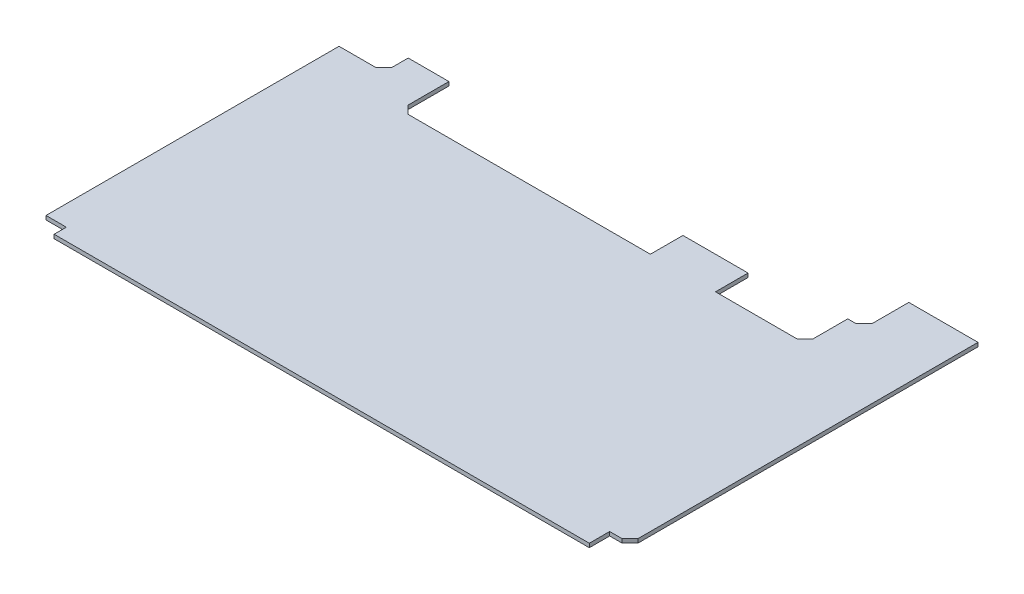
ISO-10303-21;
HEADER;
FILE_DESCRIPTION(('STEP AP214'),'2;1');
FILE_NAME('part.step','',(''),(''),'','','');
FILE_SCHEMA(('AUTOMOTIVE_DESIGN { 1 0 10303 214 1 1 1 1 }'));
ENDSEC;
DATA;
#1=APPLICATION_CONTEXT('core data for automotive mechanical design processes');
#2=APPLICATION_PROTOCOL_DEFINITION('international standard','automotive_design',2000,#1);
#3=PRODUCT_CONTEXT('',#1,'mechanical');
#4=PRODUCT('Part','Part','',(#3));
#5=PRODUCT_RELATED_PRODUCT_CATEGORY('part','',(#4));
#6=PRODUCT_DEFINITION_FORMATION('','',#4);
#7=PRODUCT_DEFINITION_CONTEXT('part definition',#1,'design');
#8=PRODUCT_DEFINITION('design','',#6,#7);
#9=PRODUCT_DEFINITION_SHAPE('','',#8);
#10=(LENGTH_UNIT() NAMED_UNIT(*) SI_UNIT(.MILLI.,.METRE.));
#11=(NAMED_UNIT(*) PLANE_ANGLE_UNIT() SI_UNIT($,.RADIAN.));
#12=(NAMED_UNIT(*) SI_UNIT($,.STERADIAN.) SOLID_ANGLE_UNIT());
#13=UNCERTAINTY_MEASURE_WITH_UNIT(LENGTH_MEASURE(1.E-05),#10,'distance_accuracy_value','');
#14=(GEOMETRIC_REPRESENTATION_CONTEXT(3) GLOBAL_UNCERTAINTY_ASSIGNED_CONTEXT((#13)) GLOBAL_UNIT_ASSIGNED_CONTEXT((#10,
#11,#12)) REPRESENTATION_CONTEXT('',''));
#15=CARTESIAN_POINT('',(0.,0.,0.));
#16=DIRECTION('',(0.,0.,1.));
#17=DIRECTION('',(1.,0.,0.));
#18=AXIS2_PLACEMENT_3D('',#15,#16,#17);
#19=CARTESIAN_POINT('',(-78.978125,-0.000999999999999916,-37.703125));
#20=DIRECTION('',(0.,0.,1.));
#21=DIRECTION('',(1.,0.,0.));
#22=AXIS2_PLACEMENT_3D('',#19,#20,#21);
#23=PLANE('',#22);
#24=DIRECTION('',(1.,0.,0.));
#25=VECTOR('',#24,1.);
#26=CARTESIAN_POINT('',(-78.978125,0.,-37.703125));
#27=LINE('',#26,#25);
#28=CARTESIAN_POINT('',(44.053125,0.,-37.703125));
#29=VERTEX_POINT('',#28);
#30=CARTESIAN_POINT('',(75.803125,0.,-37.703125));
#31=VERTEX_POINT('',#30);
#32=EDGE_CURVE('E387',#29,#31,#27,.T.);
#33=ORIENTED_EDGE('',*,*,#32,.F.);
#34=DIRECTION('',(0.,1.,0.));
#35=VECTOR('',#34,1.);
#36=CARTESIAN_POINT('',(44.053125,-28.3980633142473,-37.703125));
#37=LINE('',#36,#35);
#38=CARTESIAN_POINT('',(44.053125,1.524,-37.703125));
#39=VERTEX_POINT('',#38);
#40=EDGE_CURVE('E351',#29,#39,#37,.T.);
#41=ORIENTED_EDGE('',*,*,#40,.T.);
#42=DIRECTION('',(1.,0.,0.));
#43=VECTOR('',#42,1.);
#44=CARTESIAN_POINT('',(-78.978125,1.524,-37.703125));
#45=LINE('',#44,#43);
#46=CARTESIAN_POINT('',(75.803125,1.524,-37.703125));
#47=VERTEX_POINT('',#46);
#48=EDGE_CURVE('E380',#39,#47,#45,.T.);
#49=ORIENTED_EDGE('',*,*,#48,.T.);
#50=DIRECTION('',(0.,-1.,0.));
#51=VECTOR('',#50,1.);
#52=CARTESIAN_POINT('',(75.803125,0.,-37.703125));
#53=LINE('',#52,#51);
#54=EDGE_CURVE('E245',#47,#31,#53,.T.);
#55=ORIENTED_EDGE('',*,*,#54,.T.);
#56=EDGE_LOOP('',(#33,#41,#49,#55));
#57=FACE_BOUND('',#56,.T.);
#58=ADVANCED_FACE('F34',(#57),#23,.F.);
#59=CARTESIAN_POINT('',(112.315625,1.524,71.834375));
#60=DIRECTION('',(-1.,0.,0.));
#61=DIRECTION('',(0.,0.,1.));
#62=AXIS2_PLACEMENT_3D('',#59,#60,#61);
#63=PLANE('',#62);
#64=DIRECTION('',(0.,0.,-1.));
#65=VECTOR('',#64,1.);
#66=CARTESIAN_POINT('',(112.315625,1.524,71.834375));
#67=LINE('',#66,#65);
#68=CARTESIAN_POINT('',(112.315625,1.524,60.721875));
#69=VERTEX_POINT('',#68);
#70=CARTESIAN_POINT('',(112.315625,1.524,-71.834375));
#71=VERTEX_POINT('',#70);
#72=EDGE_CURVE('E225',#69,#71,#67,.T.);
#73=ORIENTED_EDGE('',*,*,#72,.F.);
#74=DIRECTION('',(0.,-1.,0.));
#75=VECTOR('',#74,1.);
#76=CARTESIAN_POINT('',(112.315625,1.524,60.721875));
#77=LINE('',#76,#75);
#78=CARTESIAN_POINT('',(112.315625,0.,60.721875));
#79=VERTEX_POINT('',#78);
#80=EDGE_CURVE('E42',#69,#79,#77,.T.);
#81=ORIENTED_EDGE('',*,*,#80,.T.);
#82=DIRECTION('',(0.,0.,-1.));
#83=VECTOR('',#82,1.);
#84=CARTESIAN_POINT('',(112.315625,0.,71.834375));
#85=LINE('',#84,#83);
#86=CARTESIAN_POINT('',(112.315625,0.,-71.834375));
#87=VERTEX_POINT('',#86);
#88=EDGE_CURVE('E390',#79,#87,#85,.T.);
#89=ORIENTED_EDGE('',*,*,#88,.T.);
#90=DIRECTION('',(0.,-1.,0.));
#91=VECTOR('',#90,1.);
#92=CARTESIAN_POINT('',(112.315625,1.524,-71.834375));
#93=LINE('',#92,#91);
#94=EDGE_CURVE('E235',#71,#87,#93,.T.);
#95=ORIENTED_EDGE('',*,*,#94,.F.);
#96=EDGE_LOOP('',(#73,#81,#89,#95));
#97=FACE_BOUND('',#96,.T.);
#98=ADVANCED_FACE('F412',(#97),#63,.F.);
#99=CARTESIAN_POINT('',(-112.315625,1.524,-71.834375));
#100=DIRECTION('',(0.,0.,1.));
#101=DIRECTION('',(1.,0.,0.));
#102=AXIS2_PLACEMENT_3D('',#99,#100,#101);
#103=PLANE('',#102);
#104=DIRECTION('',(-1.,0.,0.));
#105=VECTOR('',#104,1.);
#106=CARTESIAN_POINT('',(-112.315625,0.,-71.834375));
#107=LINE('',#106,#105);
#108=CARTESIAN_POINT('',(85.328125,0.,-71.834375));
#109=VERTEX_POINT('',#108);
#110=EDGE_CURVE('E231',#87,#109,#107,.T.);
#111=ORIENTED_EDGE('',*,*,#110,.T.);
#112=DIRECTION('',(0.,1.,0.));
#113=VECTOR('',#112,1.);
#114=CARTESIAN_POINT('',(85.328125,-0.000999999999999916,-71.834375));
#115=LINE('',#114,#113);
#116=CARTESIAN_POINT('',(85.328125,1.524,-71.834375));
#117=VERTEX_POINT('',#116);
#118=EDGE_CURVE('E317',#109,#117,#115,.T.);
#119=ORIENTED_EDGE('',*,*,#118,.T.);
#120=DIRECTION('',(-1.,0.,0.));
#121=VECTOR('',#120,1.);
#122=CARTESIAN_POINT('',(-112.315625,1.524,-71.834375));
#123=LINE('',#122,#121);
#124=EDGE_CURVE('E228',#71,#117,#123,.T.);
#125=ORIENTED_EDGE('',*,*,#124,.F.);
#126=ORIENTED_EDGE('',*,*,#94,.T.);
#127=EDGE_LOOP('',(#111,#119,#125,#126));
#128=FACE_BOUND('',#127,.T.);
#129=ADVANCED_FACE('F401',(#128),#103,.F.);
#130=CARTESIAN_POINT('',(-112.315625,1.524,71.834375));
#131=DIRECTION('',(1.,0.,0.));
#132=DIRECTION('',(0.,0.,-1.));
#133=AXIS2_PLACEMENT_3D('',#130,#131,#132);
#134=PLANE('',#133);
#135=DIRECTION('',(0.,0.,1.));
#136=VECTOR('',#135,1.);
#137=CARTESIAN_POINT('',(-112.315625,0.,71.834375));
#138=LINE('',#137,#136);
#139=CARTESIAN_POINT('',(-112.315625,0.,-47.228125));
#140=VERTEX_POINT('',#139);
#141=CARTESIAN_POINT('',(-112.315625,0.,67.071875));
#142=VERTEX_POINT('',#141);
#143=EDGE_CURVE('E226',#140,#142,#138,.T.);
#144=ORIENTED_EDGE('',*,*,#143,.T.);
#145=DIRECTION('',(0.,1.,0.));
#146=VECTOR('',#145,1.);
#147=CARTESIAN_POINT('',(-112.315625,-0.000999999999999916,67.071875));
#148=LINE('',#147,#146);
#149=CARTESIAN_POINT('',(-112.315625,1.524,67.071875));
#150=VERTEX_POINT('',#149);
#151=EDGE_CURVE('E303',#142,#150,#148,.T.);
#152=ORIENTED_EDGE('',*,*,#151,.T.);
#153=DIRECTION('',(0.,0.,1.));
#154=VECTOR('',#153,1.);
#155=CARTESIAN_POINT('',(-112.315625,1.524,71.834375));
#156=LINE('',#155,#154);
#157=CARTESIAN_POINT('',(-112.315625,1.524,-47.228125));
#158=VERTEX_POINT('',#157);
#159=EDGE_CURVE('E394',#158,#150,#156,.T.);
#160=ORIENTED_EDGE('',*,*,#159,.F.);
#161=DIRECTION('',(0.,1.,0.));
#162=VECTOR('',#161,1.);
#163=CARTESIAN_POINT('',(-112.315625,-0.000999999999999916,-47.228125));
#164=LINE('',#163,#162);
#165=EDGE_CURVE('E339',#140,#158,#164,.T.);
#166=ORIENTED_EDGE('',*,*,#165,.F.);
#167=EDGE_LOOP('',(#144,#152,#160,#166));
#168=FACE_BOUND('',#167,.T.);
#169=ADVANCED_FACE('F479',(#168),#134,.F.);
#170=CARTESIAN_POINT('',(-112.315625,1.524,71.834375));
#171=DIRECTION('',(0.,0.,-1.));
#172=DIRECTION('',(-1.,0.,0.));
#173=AXIS2_PLACEMENT_3D('',#170,#171,#172);
#174=PLANE('',#173);
#175=DIRECTION('',(1.,0.,0.));
#176=VECTOR('',#175,1.);
#177=CARTESIAN_POINT('',(-112.315625,0.,71.834375));
#178=LINE('',#177,#176);
#179=CARTESIAN_POINT('',(-104.378125,0.,71.834375));
#180=VERTEX_POINT('',#179);
#181=CARTESIAN_POINT('',(104.378125,0.,71.834375));
#182=VERTEX_POINT('',#181);
#183=EDGE_CURVE('E217',#180,#182,#178,.T.);
#184=ORIENTED_EDGE('',*,*,#183,.T.);
#185=DIRECTION('',(0.,1.,0.));
#186=VECTOR('',#185,1.);
#187=CARTESIAN_POINT('',(104.378125,-0.000999999999999916,71.834375));
#188=LINE('',#187,#186);
#189=CARTESIAN_POINT('',(104.378125,1.524,71.834375));
#190=VERTEX_POINT('',#189);
#191=EDGE_CURVE('E199',#182,#190,#188,.T.);
#192=ORIENTED_EDGE('',*,*,#191,.T.);
#193=DIRECTION('',(1.,0.,0.));
#194=VECTOR('',#193,1.);
#195=CARTESIAN_POINT('',(-112.315625,1.524,71.834375));
#196=LINE('',#195,#194);
#197=CARTESIAN_POINT('',(-104.378125,1.524,71.834375));
#198=VERTEX_POINT('',#197);
#199=EDGE_CURVE('E239',#198,#190,#196,.T.);
#200=ORIENTED_EDGE('',*,*,#199,.F.);
#201=DIRECTION('',(0.,1.,0.));
#202=VECTOR('',#201,1.);
#203=CARTESIAN_POINT('',(-104.378125,-0.000999999999999916,71.834375));
#204=LINE('',#203,#202);
#205=EDGE_CURVE('E224',#180,#198,#204,.T.);
#206=ORIENTED_EDGE('',*,*,#205,.F.);
#207=EDGE_LOOP('',(#184,#192,#200,#206));
#208=FACE_BOUND('',#207,.T.);
#209=ADVANCED_FACE('F223',(#208),#174,.F.);
#210=CARTESIAN_POINT('',(112.315625,1.524,-71.834375));
#211=DIRECTION('',(0.,-1.,0.));
#212=DIRECTION('',(0.,0.,-1.));
#213=AXIS2_PLACEMENT_3D('',#210,#211,#212);
#214=PLANE('',#213);
#215=DIRECTION('',(-1.,0.,0.));
#216=VECTOR('',#215,1.);
#217=CARTESIAN_POINT('',(112.315625,1.524,63.896875));
#218=LINE('',#217,#216);
#219=CARTESIAN_POINT('',(109.140625,1.524,63.896875));
#220=VERTEX_POINT('',#219);
#221=CARTESIAN_POINT('',(104.378125,1.524,63.896875));
#222=VERTEX_POINT('',#221);
#223=EDGE_CURVE('E220',#220,#222,#218,.T.);
#224=ORIENTED_EDGE('',*,*,#223,.F.);
#225=DIRECTION('',(-0.707106781186544,0.,0.707106781186551));
#226=VECTOR('',#225,1.);
#227=CARTESIAN_POINT('',(109.140625,1.524,63.896875));
#228=LINE('',#227,#226);
#229=EDGE_CURVE('E56',#220,#69,#228,.F.);
#230=ORIENTED_EDGE('',*,*,#229,.T.);
#231=ORIENTED_EDGE('',*,*,#72,.T.);
#232=ORIENTED_EDGE('',*,*,#124,.T.);
#233=DIRECTION('',(0.,0.,-1.));
#234=VECTOR('',#233,1.);
#235=CARTESIAN_POINT('',(85.328125,1.524,-71.834375));
#236=LINE('',#235,#234);
#237=CARTESIAN_POINT('',(85.328125,1.524,-57.5468750000001));
#238=VERTEX_POINT('',#237);
#239=EDGE_CURVE('E314',#238,#117,#236,.T.);
#240=ORIENTED_EDGE('',*,*,#239,.F.);
#241=DIRECTION('',(0.707106781186541,0.,-0.707106781186554));
#242=VECTOR('',#241,1.);
#243=CARTESIAN_POINT('',(105.965625,1.524,-78.1843750000001));
#244=LINE('',#243,#242);
#245=CARTESIAN_POINT('',(82.153125,1.524,-54.371875));
#246=VERTEX_POINT('',#245);
#247=EDGE_CURVE('E275',#238,#246,#244,.F.);
#248=ORIENTED_EDGE('',*,*,#247,.T.);
#249=DIRECTION('',(1.,0.,0.));
#250=VECTOR('',#249,1.);
#251=CARTESIAN_POINT('',(78.978125,1.524,-54.371875));
#252=LINE('',#251,#250);
#253=CARTESIAN_POINT('',(78.978125,1.524,-54.371875));
#254=VERTEX_POINT('',#253);
#255=EDGE_CURVE('E311',#254,#246,#252,.T.);
#256=ORIENTED_EDGE('',*,*,#255,.F.);
#257=DIRECTION('',(0.,0.,-1.));
#258=VECTOR('',#257,1.);
#259=CARTESIAN_POINT('',(78.978125,1.524,-71.834375));
#260=LINE('',#259,#258);
#261=CARTESIAN_POINT('',(78.978125,1.524,-40.8781250000001));
#262=VERTEX_POINT('',#261);
#263=EDGE_CURVE('E384',#262,#254,#260,.T.);
#264=ORIENTED_EDGE('',*,*,#263,.F.);
#265=DIRECTION('',(0.707106781186541,0.,-0.707106781186554));
#266=VECTOR('',#265,1.);
#267=CARTESIAN_POINT('',(111.125,1.524,-73.0250000000003));
#268=LINE('',#267,#266);
#269=EDGE_CURVE('E251',#262,#47,#268,.F.);
#270=ORIENTED_EDGE('',*,*,#269,.T.);
#271=ORIENTED_EDGE('',*,*,#48,.F.);
#272=DIRECTION('',(0.,0.,-1.));
#273=VECTOR('',#272,1.);
#274=CARTESIAN_POINT('',(44.053125,1.524,-37.703125));
#275=LINE('',#274,#273);
#276=CARTESIAN_POINT('',(44.053125,1.524,-50.403125));
#277=VERTEX_POINT('',#276);
#278=EDGE_CURVE('E352',#39,#277,#275,.T.);
#279=ORIENTED_EDGE('',*,*,#278,.T.);
#280=DIRECTION('',(-1.,0.,0.));
#281=VECTOR('',#280,1.);
#282=CARTESIAN_POINT('',(18.653125,1.524,-50.403125));
#283=LINE('',#282,#281);
#284=CARTESIAN_POINT('',(18.653125,1.524,-50.403125));
#285=VERTEX_POINT('',#284);
#286=EDGE_CURVE('E348',#277,#285,#283,.T.);
#287=ORIENTED_EDGE('',*,*,#286,.T.);
#288=DIRECTION('',(0.,0.,1.));
#289=VECTOR('',#288,1.);
#290=CARTESIAN_POINT('',(18.653125,1.524,-37.703125));
#291=LINE('',#290,#289);
#292=CARTESIAN_POINT('',(18.653125,1.524,-37.703125));
#293=VERTEX_POINT('',#292);
#294=EDGE_CURVE('E343',#285,#293,#291,.T.);
#295=ORIENTED_EDGE('',*,*,#294,.T.);
#296=CARTESIAN_POINT('',(-75.8031249999999,1.524,-37.703125));
#297=VERTEX_POINT('',#296);
#298=EDGE_CURVE('E381',#297,#293,#45,.T.);
#299=ORIENTED_EDGE('',*,*,#298,.F.);
#300=DIRECTION('',(0.707106781186554,0.,0.707106781186541));
#301=VECTOR('',#300,1.);
#302=CARTESIAN_POINT('',(1.19062500000165,1.524,39.2906250000003));
#303=LINE('',#302,#301);
#304=CARTESIAN_POINT('',(-78.978125,1.524,-40.878125));
#305=VERTEX_POINT('',#304);
#306=EDGE_CURVE('E256',#297,#305,#303,.F.);
#307=ORIENTED_EDGE('',*,*,#306,.T.);
#308=DIRECTION('',(0.,0.,1.));
#309=VECTOR('',#308,1.);
#310=CARTESIAN_POINT('',(-78.978125,1.524,-71.834375));
#311=LINE('',#310,#309);
#312=CARTESIAN_POINT('',(-78.978125,1.524,-56.753125));
#313=VERTEX_POINT('',#312);
#314=EDGE_CURVE('E378',#313,#305,#311,.T.);
#315=ORIENTED_EDGE('',*,*,#314,.F.);
#316=DIRECTION('',(1.,0.,0.));
#317=VECTOR('',#316,1.);
#318=CARTESIAN_POINT('',(-78.978125,1.524,-56.753125));
#319=LINE('',#318,#317);
#320=CARTESIAN_POINT('',(-94.853125,1.524,-56.753125));
#321=VERTEX_POINT('',#320);
#322=EDGE_CURVE('E337',#321,#313,#319,.T.);
#323=ORIENTED_EDGE('',*,*,#322,.F.);
#324=DIRECTION('',(0.,0.,-1.));
#325=VECTOR('',#324,1.);
#326=CARTESIAN_POINT('',(-94.853125,1.524,-56.753125));
#327=LINE('',#326,#325);
#328=CARTESIAN_POINT('',(-94.853125,1.524,-50.4031250000001));
#329=VERTEX_POINT('',#328);
#330=EDGE_CURVE('E335',#329,#321,#327,.T.);
#331=ORIENTED_EDGE('',*,*,#330,.F.);
#332=DIRECTION('',(0.707106781186541,0.,-0.707106781186554));
#333=VECTOR('',#332,1.);
#334=CARTESIAN_POINT('',(19.4468749999981,1.524,-164.703125));
#335=LINE('',#334,#333);
#336=CARTESIAN_POINT('',(-98.028125,1.524,-47.228125));
#337=VERTEX_POINT('',#336);
#338=EDGE_CURVE('E271',#329,#337,#335,.F.);
#339=ORIENTED_EDGE('',*,*,#338,.T.);
#340=DIRECTION('',(1.,0.,0.));
#341=VECTOR('',#340,1.);
#342=CARTESIAN_POINT('',(-94.853125,1.524,-47.228125));
#343=LINE('',#342,#341);
#344=EDGE_CURVE('E332',#158,#337,#343,.T.);
#345=ORIENTED_EDGE('',*,*,#344,.F.);
#346=ORIENTED_EDGE('',*,*,#159,.T.);
#347=DIRECTION('',(-1.,0.,0.));
#348=VECTOR('',#347,1.);
#349=CARTESIAN_POINT('',(-112.315625,1.524,67.071875));
#350=LINE('',#349,#348);
#351=CARTESIAN_POINT('',(-104.378125,1.524,67.071875));
#352=VERTEX_POINT('',#351);
#353=EDGE_CURVE('E301',#352,#150,#350,.T.);
#354=ORIENTED_EDGE('',*,*,#353,.F.);
#355=DIRECTION('',(0.,0.,-1.));
#356=VECTOR('',#355,1.);
#357=CARTESIAN_POINT('',(-104.378125,1.524,71.834375));
#358=LINE('',#357,#356);
#359=EDGE_CURVE('E298',#198,#352,#358,.T.);
#360=ORIENTED_EDGE('',*,*,#359,.F.);
#361=ORIENTED_EDGE('',*,*,#199,.T.);
#362=DIRECTION('',(0.,0.,1.));
#363=VECTOR('',#362,1.);
#364=CARTESIAN_POINT('',(104.378125,1.524,71.834375));
#365=LINE('',#364,#363);
#366=EDGE_CURVE('E205',#222,#190,#365,.T.);
#367=ORIENTED_EDGE('',*,*,#366,.F.);
#368=EDGE_LOOP('',(#224,#230,#231,#232,#240,#248,#256,#264,#270,#271,#279,#287,#295,#299,#307,
#315,#323,#331,#339,#345,#346,#354,#360,#361,#367));
#369=FACE_BOUND('',#368,.T.);
#370=ADVANCED_FACE('F287',(#369),#214,.F.);
#371=CARTESIAN_POINT('',(112.315625,0.,-71.834375));
#372=DIRECTION('',(0.,-1.,0.));
#373=DIRECTION('',(0.,0.,-1.));
#374=AXIS2_PLACEMENT_3D('',#371,#372,#373);
#375=PLANE('',#374);
#376=ORIENTED_EDGE('',*,*,#88,.F.);
#377=DIRECTION('',(0.707106781186544,0.,-0.707106781186551));
#378=VECTOR('',#377,1.);
#379=CARTESIAN_POINT('',(178.59375,0.,-5.55625000000054));
#380=LINE('',#379,#378);
#381=CARTESIAN_POINT('',(109.140625,0.,63.896875));
#382=VERTEX_POINT('',#381);
#383=EDGE_CURVE('E11',#79,#382,#380,.F.);
#384=ORIENTED_EDGE('',*,*,#383,.T.);
#385=DIRECTION('',(-1.,0.,0.));
#386=VECTOR('',#385,1.);
#387=CARTESIAN_POINT('',(112.315625,0.,63.896875));
#388=LINE('',#387,#386);
#389=CARTESIAN_POINT('',(104.378125,0.,63.896875));
#390=VERTEX_POINT('',#389);
#391=EDGE_CURVE('E210',#382,#390,#388,.T.);
#392=ORIENTED_EDGE('',*,*,#391,.T.);
#393=DIRECTION('',(0.,0.,1.));
#394=VECTOR('',#393,1.);
#395=CARTESIAN_POINT('',(104.378125,0.,71.834375));
#396=LINE('',#395,#394);
#397=EDGE_CURVE('E203',#390,#182,#396,.T.);
#398=ORIENTED_EDGE('',*,*,#397,.T.);
#399=ORIENTED_EDGE('',*,*,#183,.F.);
#400=DIRECTION('',(0.,0.,-1.));
#401=VECTOR('',#400,1.);
#402=CARTESIAN_POINT('',(-104.378125,0.,71.834375));
#403=LINE('',#402,#401);
#404=CARTESIAN_POINT('',(-104.378125,0.,67.071875));
#405=VERTEX_POINT('',#404);
#406=EDGE_CURVE('E293',#180,#405,#403,.T.);
#407=ORIENTED_EDGE('',*,*,#406,.T.);
#408=DIRECTION('',(-1.,0.,0.));
#409=VECTOR('',#408,1.);
#410=CARTESIAN_POINT('',(-112.315625,0.,67.071875));
#411=LINE('',#410,#409);
#412=EDGE_CURVE('E295',#405,#142,#411,.T.);
#413=ORIENTED_EDGE('',*,*,#412,.T.);
#414=ORIENTED_EDGE('',*,*,#143,.F.);
#415=DIRECTION('',(1.,0.,0.));
#416=VECTOR('',#415,1.);
#417=CARTESIAN_POINT('',(-94.853125,0.,-47.228125));
#418=LINE('',#417,#416);
#419=CARTESIAN_POINT('',(-98.028125,0.,-47.228125));
#420=VERTEX_POINT('',#419);
#421=EDGE_CURVE('E324',#140,#420,#418,.T.);
#422=ORIENTED_EDGE('',*,*,#421,.T.);
#423=DIRECTION('',(-0.707106781186541,0.,0.707106781186554));
#424=VECTOR('',#423,1.);
#425=CARTESIAN_POINT('',(-94.853125,0.,-50.4031250000001));
#426=LINE('',#425,#424);
#427=CARTESIAN_POINT('',(-94.853125,0.,-50.4031250000001));
#428=VERTEX_POINT('',#427);
#429=EDGE_CURVE('E273',#420,#428,#426,.F.);
#430=ORIENTED_EDGE('',*,*,#429,.T.);
#431=DIRECTION('',(0.,0.,-1.));
#432=VECTOR('',#431,1.);
#433=CARTESIAN_POINT('',(-94.853125,0.,-56.753125));
#434=LINE('',#433,#432);
#435=CARTESIAN_POINT('',(-94.853125,0.,-56.753125));
#436=VERTEX_POINT('',#435);
#437=EDGE_CURVE('E327',#428,#436,#434,.T.);
#438=ORIENTED_EDGE('',*,*,#437,.T.);
#439=DIRECTION('',(1.,0.,0.));
#440=VECTOR('',#439,1.);
#441=CARTESIAN_POINT('',(-78.978125,0.,-56.753125));
#442=LINE('',#441,#440);
#443=CARTESIAN_POINT('',(-78.978125,0.,-56.753125));
#444=VERTEX_POINT('',#443);
#445=EDGE_CURVE('E329',#436,#444,#442,.T.);
#446=ORIENTED_EDGE('',*,*,#445,.T.);
#447=DIRECTION('',(0.,0.,1.));
#448=VECTOR('',#447,1.);
#449=CARTESIAN_POINT('',(-78.978125,0.,-71.834375));
#450=LINE('',#449,#448);
#451=CARTESIAN_POINT('',(-78.978125,0.,-40.878125));
#452=VERTEX_POINT('',#451);
#453=EDGE_CURVE('E376',#444,#452,#450,.T.);
#454=ORIENTED_EDGE('',*,*,#453,.T.);
#455=DIRECTION('',(-0.707106781186554,0.,-0.707106781186541));
#456=VECTOR('',#455,1.);
#457=CARTESIAN_POINT('',(-75.8031249999999,0.,-37.703125));
#458=LINE('',#457,#456);
#459=CARTESIAN_POINT('',(-75.8031249999999,0.,-37.703125));
#460=VERTEX_POINT('',#459);
#461=EDGE_CURVE('E259',#452,#460,#458,.F.);
#462=ORIENTED_EDGE('',*,*,#461,.T.);
#463=CARTESIAN_POINT('',(18.653125,0.,-37.703125));
#464=VERTEX_POINT('',#463);
#465=EDGE_CURVE('E388',#460,#464,#27,.T.);
#466=ORIENTED_EDGE('',*,*,#465,.T.);
#467=DIRECTION('',(0.,0.,1.));
#468=VECTOR('',#467,1.);
#469=CARTESIAN_POINT('',(18.653125,0.,-37.703125));
#470=LINE('',#469,#468);
#471=CARTESIAN_POINT('',(18.653125,0.,-50.403125));
#472=VERTEX_POINT('',#471);
#473=EDGE_CURVE('E357',#472,#464,#470,.T.);
#474=ORIENTED_EDGE('',*,*,#473,.F.);
#475=DIRECTION('',(-1.,0.,0.));
#476=VECTOR('',#475,1.);
#477=CARTESIAN_POINT('',(18.653125,0.,-50.403125));
#478=LINE('',#477,#476);
#479=CARTESIAN_POINT('',(44.053125,0.,-50.403125));
#480=VERTEX_POINT('',#479);
#481=EDGE_CURVE('E361',#480,#472,#478,.T.);
#482=ORIENTED_EDGE('',*,*,#481,.F.);
#483=DIRECTION('',(0.,0.,-1.));
#484=VECTOR('',#483,1.);
#485=CARTESIAN_POINT('',(44.053125,0.,-37.703125));
#486=LINE('',#485,#484);
#487=EDGE_CURVE('E365',#29,#480,#486,.T.);
#488=ORIENTED_EDGE('',*,*,#487,.F.);
#489=ORIENTED_EDGE('',*,*,#32,.T.);
#490=DIRECTION('',(-0.707106781186541,0.,0.707106781186554));
#491=VECTOR('',#490,1.);
#492=CARTESIAN_POINT('',(78.978125,0.,-40.8781250000001));
#493=LINE('',#492,#491);
#494=CARTESIAN_POINT('',(78.978125,0.,-40.8781250000001));
#495=VERTEX_POINT('',#494);
#496=EDGE_CURVE('E254',#31,#495,#493,.F.);
#497=ORIENTED_EDGE('',*,*,#496,.T.);
#498=DIRECTION('',(0.,0.,-1.));
#499=VECTOR('',#498,1.);
#500=CARTESIAN_POINT('',(78.978125,0.,-71.834375));
#501=LINE('',#500,#499);
#502=CARTESIAN_POINT('',(78.978125,0.,-54.371875));
#503=VERTEX_POINT('',#502);
#504=EDGE_CURVE('E373',#495,#503,#501,.T.);
#505=ORIENTED_EDGE('',*,*,#504,.T.);
#506=DIRECTION('',(1.,0.,0.));
#507=VECTOR('',#506,1.);
#508=CARTESIAN_POINT('',(78.978125,0.,-54.371875));
#509=LINE('',#508,#507);
#510=CARTESIAN_POINT('',(82.153125,0.,-54.371875));
#511=VERTEX_POINT('',#510);
#512=EDGE_CURVE('E320',#503,#511,#509,.T.);
#513=ORIENTED_EDGE('',*,*,#512,.T.);
#514=DIRECTION('',(-0.707106781186541,0.,0.707106781186554));
#515=VECTOR('',#514,1.);
#516=CARTESIAN_POINT('',(85.328125,0.,-57.5468750000001));
#517=LINE('',#516,#515);
#518=CARTESIAN_POINT('',(85.328125,0.,-57.5468750000001));
#519=VERTEX_POINT('',#518);
#520=EDGE_CURVE('E277',#511,#519,#517,.F.);
#521=ORIENTED_EDGE('',*,*,#520,.T.);
#522=DIRECTION('',(0.,0.,-1.));
#523=VECTOR('',#522,1.);
#524=CARTESIAN_POINT('',(85.328125,0.,-71.834375));
#525=LINE('',#524,#523);
#526=EDGE_CURVE('E306',#519,#109,#525,.T.);
#527=ORIENTED_EDGE('',*,*,#526,.T.);
#528=ORIENTED_EDGE('',*,*,#110,.F.);
#529=EDGE_LOOP('',(#376,#384,#392,#398,#399,#407,#413,#414,#422,#430,#438,#446,#454,#462,#466,
#474,#482,#488,#489,#497,#505,#513,#521,#527,#528));
#530=FACE_BOUND('',#529,.T.);
#531=ADVANCED_FACE('F215',(#530),#375,.T.);
#532=CARTESIAN_POINT('',(-78.978125,-0.000999999999999916,-71.834375));
#533=DIRECTION('',(-1.,0.,0.));
#534=DIRECTION('',(0.,0.,1.));
#535=AXIS2_PLACEMENT_3D('',#532,#533,#534);
#536=PLANE('',#535);
#537=ORIENTED_EDGE('',*,*,#453,.F.);
#538=DIRECTION('',(0.,1.,0.));
#539=VECTOR('',#538,1.);
#540=CARTESIAN_POINT('',(-78.978125,-0.000999999999999916,-56.753125));
#541=LINE('',#540,#539);
#542=EDGE_CURVE('E340',#444,#313,#541,.T.);
#543=ORIENTED_EDGE('',*,*,#542,.T.);
#544=ORIENTED_EDGE('',*,*,#314,.T.);
#545=DIRECTION('',(0.,-1.,0.));
#546=VECTOR('',#545,1.);
#547=CARTESIAN_POINT('',(-78.978125,0.,-40.878125));
#548=LINE('',#547,#546);
#549=EDGE_CURVE('E248',#305,#452,#548,.T.);
#550=ORIENTED_EDGE('',*,*,#549,.T.);
#551=EDGE_LOOP('',(#537,#543,#544,#550));
#552=FACE_BOUND('',#551,.T.);
#553=ADVANCED_FACE('F440',(#552),#536,.F.);
#554=CARTESIAN_POINT('',(78.978125,-0.000999999999999916,-71.834375));
#555=DIRECTION('',(1.,0.,0.));
#556=DIRECTION('',(0.,0.,-1.));
#557=AXIS2_PLACEMENT_3D('',#554,#555,#556);
#558=PLANE('',#557);
#559=ORIENTED_EDGE('',*,*,#263,.T.);
#560=DIRECTION('',(0.,1.,0.));
#561=VECTOR('',#560,1.);
#562=CARTESIAN_POINT('',(78.978125,-0.000999999999999916,-54.371875));
#563=LINE('',#562,#561);
#564=EDGE_CURVE('E316',#503,#254,#563,.T.);
#565=ORIENTED_EDGE('',*,*,#564,.F.);
#566=ORIENTED_EDGE('',*,*,#504,.F.);
#567=DIRECTION('',(0.,1.,0.));
#568=VECTOR('',#567,1.);
#569=CARTESIAN_POINT('',(78.978125,1.524,-40.8781250000001));
#570=LINE('',#569,#568);
#571=EDGE_CURVE('E238',#495,#262,#570,.T.);
#572=ORIENTED_EDGE('',*,*,#571,.T.);
#573=EDGE_LOOP('',(#559,#565,#566,#572));
#574=FACE_BOUND('',#573,.T.);
#575=ADVANCED_FACE('F431',(#574),#558,.F.);
#576=ORIENTED_EDGE('',*,*,#298,.T.);
#577=DIRECTION('',(0.,1.,0.));
#578=VECTOR('',#577,1.);
#579=CARTESIAN_POINT('',(18.653125,-28.3980633142473,-37.703125));
#580=LINE('',#579,#578);
#581=EDGE_CURVE('E359',#464,#293,#580,.T.);
#582=ORIENTED_EDGE('',*,*,#581,.F.);
#583=ORIENTED_EDGE('',*,*,#465,.F.);
#584=DIRECTION('',(0.,1.,0.));
#585=VECTOR('',#584,1.);
#586=CARTESIAN_POINT('',(-75.8031249999999,1.524,-37.703125));
#587=LINE('',#586,#585);
#588=EDGE_CURVE('E242',#460,#297,#587,.T.);
#589=ORIENTED_EDGE('',*,*,#588,.T.);
#590=EDGE_LOOP('',(#576,#582,#583,#589));
#591=FACE_BOUND('',#590,.T.);
#592=ADVANCED_FACE('F421',(#591),#23,.F.);
#593=CARTESIAN_POINT('',(78.978125,-0.000999999999999916,-40.8781250000001));
#594=DIRECTION('',(-0.707106781186554,0.,-0.707106781186541));
#595=DIRECTION('',(-0.707106781186541,0.,0.707106781186554));
#596=AXIS2_PLACEMENT_3D('',#593,#594,#595);
#597=PLANE('',#596);
#598=ORIENTED_EDGE('',*,*,#496,.F.);
#599=ORIENTED_EDGE('',*,*,#54,.F.);
#600=ORIENTED_EDGE('',*,*,#269,.F.);
#601=ORIENTED_EDGE('',*,*,#571,.F.);
#602=EDGE_LOOP('',(#598,#599,#600,#601));
#603=FACE_BOUND('',#602,.T.);
#604=ADVANCED_FACE('F430',(#603),#597,.T.);
#605=CARTESIAN_POINT('',(-75.8031249999999,-0.000999999999999916,-37.703125));
#606=DIRECTION('',(0.707106781186541,0.,-0.707106781186554));
#607=DIRECTION('',(-0.707106781186554,0.,-0.707106781186541));
#608=AXIS2_PLACEMENT_3D('',#605,#606,#607);
#609=PLANE('',#608);
#610=ORIENTED_EDGE('',*,*,#461,.F.);
#611=ORIENTED_EDGE('',*,*,#549,.F.);
#612=ORIENTED_EDGE('',*,*,#306,.F.);
#613=ORIENTED_EDGE('',*,*,#588,.F.);
#614=EDGE_LOOP('',(#610,#611,#612,#613));
#615=FACE_BOUND('',#614,.T.);
#616=ADVANCED_FACE('F437',(#615),#609,.T.);
#617=CARTESIAN_POINT('',(44.053125,-28.3980633142473,-37.703125));
#618=DIRECTION('',(1.,0.,0.));
#619=DIRECTION('',(0.,0.,-1.));
#620=AXIS2_PLACEMENT_3D('',#617,#618,#619);
#621=PLANE('',#620);
#622=ORIENTED_EDGE('',*,*,#40,.F.);
#623=ORIENTED_EDGE('',*,*,#487,.T.);
#624=DIRECTION('',(0.,1.,0.));
#625=VECTOR('',#624,1.);
#626=CARTESIAN_POINT('',(44.053125,-28.3980633142473,-50.403125));
#627=LINE('',#626,#625);
#628=EDGE_CURVE('E364',#480,#277,#627,.T.);
#629=ORIENTED_EDGE('',*,*,#628,.T.);
#630=ORIENTED_EDGE('',*,*,#278,.F.);
#631=EDGE_LOOP('',(#622,#623,#629,#630));
#632=FACE_BOUND('',#631,.T.);
#633=ADVANCED_FACE('F514',(#632),#621,.T.);
#634=CARTESIAN_POINT('',(18.653125,-28.3980633142473,-50.403125));
#635=DIRECTION('',(0.,0.,-1.));
#636=DIRECTION('',(-1.,0.,0.));
#637=AXIS2_PLACEMENT_3D('',#634,#635,#636);
#638=PLANE('',#637);
#639=ORIENTED_EDGE('',*,*,#628,.F.);
#640=ORIENTED_EDGE('',*,*,#481,.T.);
#641=DIRECTION('',(0.,1.,0.));
#642=VECTOR('',#641,1.);
#643=CARTESIAN_POINT('',(18.653125,-28.3980633142473,-50.403125));
#644=LINE('',#643,#642);
#645=EDGE_CURVE('E360',#472,#285,#644,.T.);
#646=ORIENTED_EDGE('',*,*,#645,.T.);
#647=ORIENTED_EDGE('',*,*,#286,.F.);
#648=EDGE_LOOP('',(#639,#640,#646,#647));
#649=FACE_BOUND('',#648,.T.);
#650=ADVANCED_FACE('F511',(#649),#638,.T.);
#651=CARTESIAN_POINT('',(18.653125,-28.3980633142473,-37.703125));
#652=DIRECTION('',(-1.,0.,0.));
#653=DIRECTION('',(0.,0.,1.));
#654=AXIS2_PLACEMENT_3D('',#651,#652,#653);
#655=PLANE('',#654);
#656=ORIENTED_EDGE('',*,*,#645,.F.);
#657=ORIENTED_EDGE('',*,*,#473,.T.);
#658=ORIENTED_EDGE('',*,*,#581,.T.);
#659=ORIENTED_EDGE('',*,*,#294,.F.);
#660=EDGE_LOOP('',(#656,#657,#658,#659));
#661=FACE_BOUND('',#660,.T.);
#662=ADVANCED_FACE('F452',(#661),#655,.T.);
#663=CARTESIAN_POINT('',(-78.978125,-0.000999999999999916,-56.753125));
#664=DIRECTION('',(0.,0.,1.));
#665=DIRECTION('',(1.,0.,0.));
#666=AXIS2_PLACEMENT_3D('',#663,#664,#665);
#667=PLANE('',#666);
#668=DIRECTION('',(0.,1.,0.));
#669=VECTOR('',#668,1.);
#670=CARTESIAN_POINT('',(-94.853125,-0.000999999999999916,-56.753125));
#671=LINE('',#670,#669);
#672=EDGE_CURVE('E344',#436,#321,#671,.T.);
#673=ORIENTED_EDGE('',*,*,#672,.T.);
#674=ORIENTED_EDGE('',*,*,#322,.T.);
#675=ORIENTED_EDGE('',*,*,#542,.F.);
#676=ORIENTED_EDGE('',*,*,#445,.F.);
#677=EDGE_LOOP('',(#673,#674,#675,#676));
#678=FACE_BOUND('',#677,.T.);
#679=ADVANCED_FACE('F461',(#678),#667,.F.);
#680=CARTESIAN_POINT('',(-94.853125,-0.000999999999999916,-56.753125));
#681=DIRECTION('',(1.,0.,0.));
#682=DIRECTION('',(0.,0.,-1.));
#683=AXIS2_PLACEMENT_3D('',#680,#681,#682);
#684=PLANE('',#683);
#685=ORIENTED_EDGE('',*,*,#437,.F.);
#686=DIRECTION('',(0.,1.,0.));
#687=VECTOR('',#686,1.);
#688=CARTESIAN_POINT('',(-94.853125,1.524,-50.4031250000001));
#689=LINE('',#688,#687);
#690=EDGE_CURVE('E261',#428,#329,#689,.T.);
#691=ORIENTED_EDGE('',*,*,#690,.T.);
#692=ORIENTED_EDGE('',*,*,#330,.T.);
#693=ORIENTED_EDGE('',*,*,#672,.F.);
#694=EDGE_LOOP('',(#685,#691,#692,#693));
#695=FACE_BOUND('',#694,.T.);
#696=ADVANCED_FACE('F466',(#695),#684,.F.);
#697=CARTESIAN_POINT('',(-94.853125,-0.000999999999999916,-47.228125));
#698=DIRECTION('',(0.,0.,1.));
#699=DIRECTION('',(1.,0.,0.));
#700=AXIS2_PLACEMENT_3D('',#697,#698,#699);
#701=PLANE('',#700);
#702=ORIENTED_EDGE('',*,*,#344,.T.);
#703=DIRECTION('',(0.,-1.,0.));
#704=VECTOR('',#703,1.);
#705=CARTESIAN_POINT('',(-98.028125,0.,-47.228125));
#706=LINE('',#705,#704);
#707=EDGE_CURVE('E264',#337,#420,#706,.T.);
#708=ORIENTED_EDGE('',*,*,#707,.T.);
#709=ORIENTED_EDGE('',*,*,#421,.F.);
#710=ORIENTED_EDGE('',*,*,#165,.T.);
#711=EDGE_LOOP('',(#702,#708,#709,#710));
#712=FACE_BOUND('',#711,.T.);
#713=ADVANCED_FACE('F475',(#712),#701,.F.);
#714=CARTESIAN_POINT('',(85.328125,-0.000999999999999916,-71.834375));
#715=DIRECTION('',(1.,0.,0.));
#716=DIRECTION('',(0.,0.,-1.));
#717=AXIS2_PLACEMENT_3D('',#714,#715,#716);
#718=PLANE('',#717);
#719=ORIENTED_EDGE('',*,*,#526,.F.);
#720=DIRECTION('',(0.,1.,0.));
#721=VECTOR('',#720,1.);
#722=CARTESIAN_POINT('',(85.328125,1.524,-57.5468750000001));
#723=LINE('',#722,#721);
#724=EDGE_CURVE('E266',#519,#238,#723,.T.);
#725=ORIENTED_EDGE('',*,*,#724,.T.);
#726=ORIENTED_EDGE('',*,*,#239,.T.);
#727=ORIENTED_EDGE('',*,*,#118,.F.);
#728=EDGE_LOOP('',(#719,#725,#726,#727));
#729=FACE_BOUND('',#728,.T.);
#730=ADVANCED_FACE('F409',(#729),#718,.F.);
#731=CARTESIAN_POINT('',(78.978125,-0.000999999999999916,-54.371875));
#732=DIRECTION('',(0.,0.,1.));
#733=DIRECTION('',(1.,0.,0.));
#734=AXIS2_PLACEMENT_3D('',#731,#732,#733);
#735=PLANE('',#734);
#736=ORIENTED_EDGE('',*,*,#255,.T.);
#737=DIRECTION('',(0.,-1.,0.));
#738=VECTOR('',#737,1.);
#739=CARTESIAN_POINT('',(82.153125,0.,-54.371875));
#740=LINE('',#739,#738);
#741=EDGE_CURVE('E269',#246,#511,#740,.T.);
#742=ORIENTED_EDGE('',*,*,#741,.T.);
#743=ORIENTED_EDGE('',*,*,#512,.F.);
#744=ORIENTED_EDGE('',*,*,#564,.T.);
#745=EDGE_LOOP('',(#736,#742,#743,#744));
#746=FACE_BOUND('',#745,.T.);
#747=ADVANCED_FACE('F499',(#746),#735,.F.);
#748=CARTESIAN_POINT('',(-94.853125,-0.000999999999999916,-50.4031250000001));
#749=DIRECTION('',(-0.707106781186554,0.,-0.707106781186541));
#750=DIRECTION('',(-0.707106781186541,0.,0.707106781186554));
#751=AXIS2_PLACEMENT_3D('',#748,#749,#750);
#752=PLANE('',#751);
#753=ORIENTED_EDGE('',*,*,#429,.F.);
#754=ORIENTED_EDGE('',*,*,#707,.F.);
#755=ORIENTED_EDGE('',*,*,#338,.F.);
#756=ORIENTED_EDGE('',*,*,#690,.F.);
#757=EDGE_LOOP('',(#753,#754,#755,#756));
#758=FACE_BOUND('',#757,.T.);
#759=ADVANCED_FACE('F470',(#758),#752,.T.);
#760=CARTESIAN_POINT('',(85.328125,-0.000999999999999916,-57.5468750000001));
#761=DIRECTION('',(-0.707106781186554,0.,-0.707106781186541));
#762=DIRECTION('',(-0.707106781186541,0.,0.707106781186554));
#763=AXIS2_PLACEMENT_3D('',#760,#761,#762);
#764=PLANE('',#763);
#765=ORIENTED_EDGE('',*,*,#520,.F.);
#766=ORIENTED_EDGE('',*,*,#741,.F.);
#767=ORIENTED_EDGE('',*,*,#247,.F.);
#768=ORIENTED_EDGE('',*,*,#724,.F.);
#769=EDGE_LOOP('',(#765,#766,#767,#768));
#770=FACE_BOUND('',#769,.T.);
#771=ADVANCED_FACE('F494',(#770),#764,.T.);
#772=CARTESIAN_POINT('',(-112.315625,-0.000999999999999916,67.071875));
#773=DIRECTION('',(0.,0.,-1.));
#774=DIRECTION('',(-1.,0.,0.));
#775=AXIS2_PLACEMENT_3D('',#772,#773,#774);
#776=PLANE('',#775);
#777=DIRECTION('',(0.,1.,0.));
#778=VECTOR('',#777,1.);
#779=CARTESIAN_POINT('',(-104.378125,-0.000999999999999916,67.071875));
#780=LINE('',#779,#778);
#781=EDGE_CURVE('E307',#405,#352,#780,.T.);
#782=ORIENTED_EDGE('',*,*,#781,.T.);
#783=ORIENTED_EDGE('',*,*,#353,.T.);
#784=ORIENTED_EDGE('',*,*,#151,.F.);
#785=ORIENTED_EDGE('',*,*,#412,.F.);
#786=EDGE_LOOP('',(#782,#783,#784,#785));
#787=FACE_BOUND('',#786,.T.);
#788=ADVANCED_FACE('F482',(#787),#776,.F.);
#789=CARTESIAN_POINT('',(-104.378125,-0.000999999999999916,71.834375));
#790=DIRECTION('',(1.,0.,0.));
#791=DIRECTION('',(0.,0.,-1.));
#792=AXIS2_PLACEMENT_3D('',#789,#790,#791);
#793=PLANE('',#792);
#794=ORIENTED_EDGE('',*,*,#205,.T.);
#795=ORIENTED_EDGE('',*,*,#359,.T.);
#796=ORIENTED_EDGE('',*,*,#781,.F.);
#797=ORIENTED_EDGE('',*,*,#406,.F.);
#798=EDGE_LOOP('',(#794,#795,#796,#797));
#799=FACE_BOUND('',#798,.T.);
#800=ADVANCED_FACE('F486',(#799),#793,.F.);
#801=CARTESIAN_POINT('',(104.378125,-0.000999999999999916,71.834375));
#802=DIRECTION('',(-1.,0.,0.));
#803=DIRECTION('',(0.,0.,1.));
#804=AXIS2_PLACEMENT_3D('',#801,#802,#803);
#805=PLANE('',#804);
#806=DIRECTION('',(0.,1.,0.));
#807=VECTOR('',#806,1.);
#808=CARTESIAN_POINT('',(104.378125,-0.000999999999999916,63.896875));
#809=LINE('',#808,#807);
#810=EDGE_CURVE('E211',#390,#222,#809,.T.);
#811=ORIENTED_EDGE('',*,*,#810,.T.);
#812=ORIENTED_EDGE('',*,*,#366,.T.);
#813=ORIENTED_EDGE('',*,*,#191,.F.);
#814=ORIENTED_EDGE('',*,*,#397,.F.);
#815=EDGE_LOOP('',(#811,#812,#813,#814));
#816=FACE_BOUND('',#815,.T.);
#817=ADVANCED_FACE('F202',(#816),#805,.F.);
#818=CARTESIAN_POINT('',(112.315625,-0.000999999999999916,63.896875));
#819=DIRECTION('',(0.,0.,-1.));
#820=DIRECTION('',(-1.,0.,0.));
#821=AXIS2_PLACEMENT_3D('',#818,#819,#820);
#822=PLANE('',#821);
#823=ORIENTED_EDGE('',*,*,#391,.F.);
#824=DIRECTION('',(0.,1.,0.));
#825=VECTOR('',#824,1.);
#826=CARTESIAN_POINT('',(109.140625,-0.000999999999999916,63.896875));
#827=LINE('',#826,#825);
#828=EDGE_CURVE('E279',#382,#220,#827,.T.);
#829=ORIENTED_EDGE('',*,*,#828,.T.);
#830=ORIENTED_EDGE('',*,*,#223,.T.);
#831=ORIENTED_EDGE('',*,*,#810,.F.);
#832=EDGE_LOOP('',(#823,#829,#830,#831));
#833=FACE_BOUND('',#832,.T.);
#834=ADVANCED_FACE('F284',(#833),#822,.F.);
#835=CARTESIAN_POINT('',(109.140625,-0.000999999999999916,63.896875));
#836=DIRECTION('',(-0.707106781186551,0.,-0.707106781186544));
#837=DIRECTION('',(-0.707106781186544,0.,0.707106781186551));
#838=AXIS2_PLACEMENT_3D('',#835,#836,#837);
#839=PLANE('',#838);
#840=ORIENTED_EDGE('',*,*,#383,.F.);
#841=ORIENTED_EDGE('',*,*,#80,.F.);
#842=ORIENTED_EDGE('',*,*,#229,.F.);
#843=ORIENTED_EDGE('',*,*,#828,.F.);
#844=EDGE_LOOP('',(#840,#841,#842,#843));
#845=FACE_BOUND('',#844,.T.);
#846=ADVANCED_FACE('F36',(#845),#839,.F.);
#847=CLOSED_SHELL('',(#58,#98,#129,#169,#209,#370,#531,#553,#575,#592,#604,#616,#633,#650,#662,
#679,#696,#713,#730,#747,#759,#771,#788,#800,#817,#834,#846));
#848=MANIFOLD_SOLID_BREP('B2',#847);
#849=ADVANCED_BREP_SHAPE_REPRESENTATION('',(#18,#848),#14);
#850=SHAPE_DEFINITION_REPRESENTATION(#9,#849);
ENDSEC;
END-ISO-10303-21;
